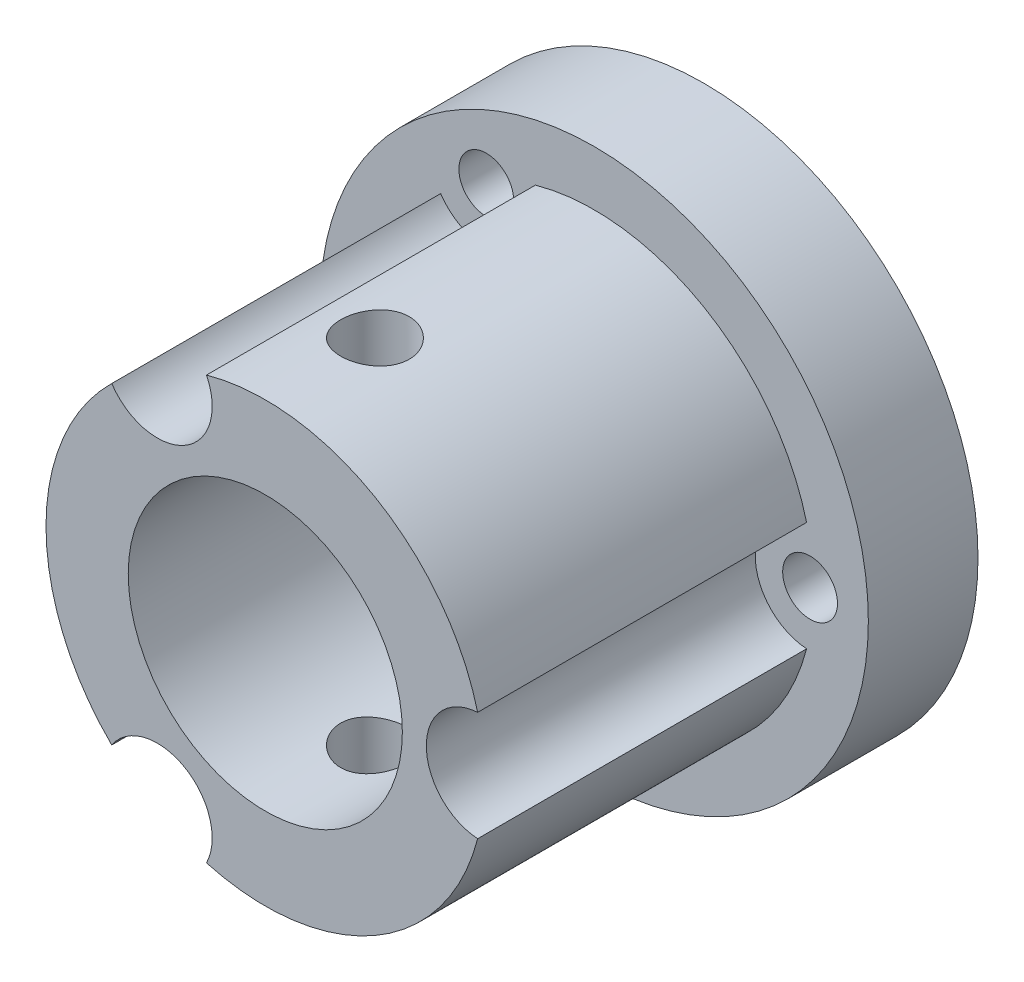
ISO-10303-21;
HEADER;
FILE_DESCRIPTION(('STEP AP214'),'2;1');
FILE_NAME('part.step','',(''),(''),'','','');
FILE_SCHEMA(('AUTOMOTIVE_DESIGN { 1 0 10303 214 1 1 1 1 }'));
ENDSEC;
DATA;
#1=APPLICATION_CONTEXT('core data for automotive mechanical design processes');
#2=APPLICATION_PROTOCOL_DEFINITION('international standard','automotive_design',2000,#1);
#3=PRODUCT_CONTEXT('',#1,'mechanical');
#4=PRODUCT('Part','Part','',(#3));
#5=PRODUCT_RELATED_PRODUCT_CATEGORY('part','',(#4));
#6=PRODUCT_DEFINITION_FORMATION('','',#4);
#7=PRODUCT_DEFINITION_CONTEXT('part definition',#1,'design');
#8=PRODUCT_DEFINITION('design','',#6,#7);
#9=PRODUCT_DEFINITION_SHAPE('','',#8);
#10=(LENGTH_UNIT() NAMED_UNIT(*) SI_UNIT(.MILLI.,.METRE.));
#11=(NAMED_UNIT(*) PLANE_ANGLE_UNIT() SI_UNIT($,.RADIAN.));
#12=(NAMED_UNIT(*) SI_UNIT($,.STERADIAN.) SOLID_ANGLE_UNIT());
#13=UNCERTAINTY_MEASURE_WITH_UNIT(LENGTH_MEASURE(1.E-05),#10,'distance_accuracy_value','');
#14=(GEOMETRIC_REPRESENTATION_CONTEXT(3) GLOBAL_UNCERTAINTY_ASSIGNED_CONTEXT((#13)) GLOBAL_UNIT_ASSIGNED_CONTEXT((#10,
#11,#12)) REPRESENTATION_CONTEXT('',''));
#15=CARTESIAN_POINT('',(0.,0.,0.));
#16=DIRECTION('',(0.,0.,1.));
#17=DIRECTION('',(1.,0.,0.));
#18=AXIS2_PLACEMENT_3D('',#15,#16,#17);
#19=CARTESIAN_POINT('',(0.,0.,25.4));
#20=DIRECTION('',(0.,0.,1.));
#21=DIRECTION('',(1.,0.,0.));
#22=AXIS2_PLACEMENT_3D('',#19,#20,#21);
#23=PLANE('',#22);
#24=CARTESIAN_POINT('',(0.,0.,25.4));
#25=DIRECTION('',(0.,0.,1.));
#26=DIRECTION('',(1.,0.,0.));
#27=AXIS2_PLACEMENT_3D('',#24,#25,#26);
#28=CIRCLE('',#27,7.9375);
#29=CARTESIAN_POINT('',(7.9375,0.,25.4));
#30=VERTEX_POINT('',#29);
#31=EDGE_CURVE('E226',#30,#30,#28,.F.);
#32=ORIENTED_EDGE('',*,*,#31,.T.);
#33=EDGE_LOOP('',(#32));
#34=FACE_BOUND('',#33,.T.);
#35=CARTESIAN_POINT('',(12.5,0.,25.4));
#36=DIRECTION('',(0.,0.,1.));
#37=DIRECTION('',(1.,0.,0.));
#38=AXIS2_PLACEMENT_3D('',#35,#36,#37);
#39=CIRCLE('',#38,3.175);
#40=CARTESIAN_POINT('',(12.298375,3.16859154189602,25.4));
#41=VERTEX_POINT('',#40);
#42=CARTESIAN_POINT('',(12.298375,-3.16859154189602,25.4));
#43=VERTEX_POINT('',#42);
#44=EDGE_CURVE('E102',#41,#43,#39,.T.);
#45=ORIENTED_EDGE('',*,*,#44,.F.);
#46=CARTESIAN_POINT('',(0.,0.,25.4));
#47=DIRECTION('',(0.,0.,1.));
#48=DIRECTION('',(1.,0.,0.));
#49=AXIS2_PLACEMENT_3D('',#46,#47,#48);
#50=CIRCLE('',#49,12.7);
#51=CARTESIAN_POINT('',(-3.40510673050151,12.2350009462155,25.4));
#52=VERTEX_POINT('',#51);
#53=EDGE_CURVE('E372',#41,#52,#50,.T.);
#54=ORIENTED_EDGE('',*,*,#53,.T.);
#55=CARTESIAN_POINT('',(-6.24999999999997,10.8253175473055,25.4));
#56=DIRECTION('',(0.,0.,1.));
#57=DIRECTION('',(1.,0.,0.));
#58=AXIS2_PLACEMENT_3D('',#55,#56,#57);
#59=CIRCLE('',#58,3.175);
#60=CARTESIAN_POINT('',(-8.89326826949843,9.06640940431946,25.4));
#61=VERTEX_POINT('',#60);
#62=EDGE_CURVE('E207',#61,#52,#59,.T.);
#63=ORIENTED_EDGE('',*,*,#62,.F.);
#64=CARTESIAN_POINT('',(-8.8932682694985,-9.06640940431939,25.4));
#65=VERTEX_POINT('',#64);
#66=EDGE_CURVE('E369',#61,#65,#50,.T.);
#67=ORIENTED_EDGE('',*,*,#66,.T.);
#68=CARTESIAN_POINT('',(-6.25000000000005,-10.8253175473055,25.4));
#69=DIRECTION('',(0.,0.,1.));
#70=DIRECTION('',(1.,0.,0.));
#71=AXIS2_PLACEMENT_3D('',#68,#69,#70);
#72=CIRCLE('',#71,3.175);
#73=CARTESIAN_POINT('',(-3.4051067305016,-12.2350009462154,25.4));
#74=VERTEX_POINT('',#73);
#75=EDGE_CURVE('E205',#74,#65,#72,.T.);
#76=ORIENTED_EDGE('',*,*,#75,.F.);
#77=EDGE_CURVE('E92',#74,#43,#50,.T.);
#78=ORIENTED_EDGE('',*,*,#77,.T.);
#79=EDGE_LOOP('',(#45,#54,#63,#67,#76,#78));
#80=FACE_BOUND('',#79,.T.);
#81=ADVANCED_FACE('F35',(#34,#80),#23,.T.);
#82=CARTESIAN_POINT('',(0.,-15.875,19.05));
#83=DIRECTION('',(0.,1.,0.));
#84=DIRECTION('',(0.,0.,1.));
#85=AXIS2_PLACEMENT_3D('',#82,#83,#84);
#86=CYLINDRICAL_SURFACE('',#85,1.9844);
#87=CARTESIAN_POINT('',(0.,7.9375,21.0344));
#88=CARTESIAN_POINT('',(-0.109639495300131,7.93749814617787,21.0343969232858));
#89=CARTESIAN_POINT('',(-0.219313359865419,7.93520571732519,21.0252829452529));
#90=CARTESIAN_POINT('',(-0.435517834281674,7.92628289923159,20.9891224451867));
#91=CARTESIAN_POINT('',(-0.542046626898072,7.91965005143554,20.9620657597011));
#92=CARTESIAN_POINT('',(-0.748807550974291,7.90278087720989,20.890942227106));
#93=CARTESIAN_POINT('',(-0.849047076454651,7.89254887937063,20.8468958069255));
#94=CARTESIAN_POINT('',(-1.04071432289624,7.86957111937874,20.7431149801415));
#95=CARTESIAN_POINT('',(-1.13214174643089,7.85682527242272,20.6833800442716));
#96=CARTESIAN_POINT('',(-1.30547263455752,7.82991001792708,20.5486182940193));
#97=CARTESIAN_POINT('',(-1.38716875416161,7.81571864705851,20.4733291653599));
#98=CARTESIAN_POINT('',(-1.53691588894592,7.78765771852449,20.3101578274106));
#99=CARTESIAN_POINT('',(-1.60496536335356,7.77378819735357,20.222274198059));
#100=CARTESIAN_POINT('',(-1.72646272123663,7.74771988482129,20.0347985799758));
#101=CARTESIAN_POINT('',(-1.77967865772164,7.73554897573591,19.9350520439062));
#102=CARTESIAN_POINT('',(-1.86850671130856,7.71457621887333,19.7276753651048));
#103=CARTESIAN_POINT('',(-1.90412164288412,7.7057738325062,19.6200464859547));
#104=CARTESIAN_POINT('',(-1.95602936354866,7.69276048780295,19.4022402365392));
#105=CARTESIAN_POINT('',(-1.9726949602536,7.68846107719747,19.2921571216639));
#106=CARTESIAN_POINT('',(-1.98739216996071,7.68467571786105,19.0706800188642));
#107=CARTESIAN_POINT('',(-1.98542681460433,7.68518898600753,18.9592862471569));
#108=CARTESIAN_POINT('',(-1.96321535658933,7.69089147981376,18.7412072199152));
#109=CARTESIAN_POINT('',(-1.94341350610029,7.69596706582694,18.634473281382));
#110=CARTESIAN_POINT('',(-1.88679984070614,7.71004120176449,18.4258925722408));
#111=CARTESIAN_POINT('',(-1.8499868139754,7.71904003116647,18.3240461503757));
#112=CARTESIAN_POINT('',(-1.76001718772595,7.74005101888939,18.1269402748486));
#113=CARTESIAN_POINT('',(-1.70669935717745,7.75209267865873,18.0317576925102));
#114=CARTESIAN_POINT('',(-1.58534638430888,7.77781587987156,17.8515311676544));
#115=CARTESIAN_POINT('',(-1.51730866658781,7.79149770809297,17.766489003355));
#116=CARTESIAN_POINT('',(-1.36614610036042,7.81943812321844,17.6064115310996));
#117=CARTESIAN_POINT('',(-1.2826463631045,7.83370203161144,17.5317307182577));
#118=CARTESIAN_POINT('',(-1.10413734292041,7.86084761283816,17.3973645243173));
#119=CARTESIAN_POINT('',(-1.00912770853849,7.87372924344148,17.3376796012881));
#120=CARTESIAN_POINT('',(-0.809790044637993,7.89672297694348,17.2348692264335));
#121=CARTESIAN_POINT('',(-0.705431128113981,7.90682541473291,17.1918013593707));
#122=CARTESIAN_POINT('',(-0.49064577602287,7.92305219211687,17.1239188568949));
#123=CARTESIAN_POINT('',(-0.380220505466809,7.92917729266133,17.0991007297947));
#124=CARTESIAN_POINT('',(-0.159467894484081,7.93664665589791,17.0689635978608));
#125=CARTESIAN_POINT('',(-0.049210366576516,7.9381092546679,17.0631618403625));
#126=CARTESIAN_POINT('',(0.170700248198422,7.93642586322305,17.0698980732427));
#127=CARTESIAN_POINT('',(0.280353388585359,7.93328028787152,17.0824344126844));
#128=CARTESIAN_POINT('',(0.494265031330528,7.92280982087153,17.1250930717754));
#129=CARTESIAN_POINT('',(0.598579397144594,7.91554755417933,17.1549520280242));
#130=CARTESIAN_POINT('',(0.800713171879479,7.89766228158763,17.2311075110972));
#131=CARTESIAN_POINT('',(0.898531923676685,7.88703893629206,17.2774056979851));
#132=CARTESIAN_POINT('',(1.0868184244775,7.86332652330072,17.3860610028415));
#133=CARTESIAN_POINT('',(1.17712492975584,7.85019704677882,17.4486885059657));
#134=CARTESIAN_POINT('',(1.34611805759531,7.82299247651863,17.5878790615911));
#135=CARTESIAN_POINT('',(1.42480267047705,7.80891721984507,17.6644445191712));
#136=CARTESIAN_POINT('',(1.57030780350973,7.78098149779881,17.8315789501613));
#137=CARTESIAN_POINT('',(1.63678969157185,7.7671347855886,17.9224455279963));
#138=CARTESIAN_POINT('',(1.75356116347712,7.74160939586383,18.1143301701208));
#139=CARTESIAN_POINT('',(1.80385146607038,7.72993062212348,18.2153477835411));
#140=CARTESIAN_POINT('',(1.88643787729623,7.71019209376046,18.424125429863));
#141=CARTESIAN_POINT('',(1.91884059406098,7.7021109547571,18.5318411641322));
#142=CARTESIAN_POINT('',(1.9650129209302,7.69046215449254,18.7514242910163));
#143=CARTESIAN_POINT('',(1.97878660614956,7.68689350613167,18.8632907701497));
#144=CARTESIAN_POINT('',(1.98709695836272,7.68474898062991,19.0845539473272));
#145=CARTESIAN_POINT('',(1.98217486750309,7.68603262453657,19.1939292808248));
#146=CARTESIAN_POINT('',(1.95447211327851,7.69312325577015,19.4102373471241));
#147=CARTESIAN_POINT('',(1.93169180882575,7.69893015218928,19.5171701289715));
#148=CARTESIAN_POINT('',(1.86921488341256,7.7143347026777,19.7249691508837));
#149=CARTESIAN_POINT('',(1.82961977996717,7.72390958292117,19.8258677176264));
#150=CARTESIAN_POINT('',(1.73471756159539,7.74577445793793,20.019661645251));
#151=CARTESIAN_POINT('',(1.67940826740484,7.75806482924642,20.1125558937535));
#152=CARTESIAN_POINT('',(1.55295084787638,7.78437647556316,20.2903196698549));
#153=CARTESIAN_POINT('',(1.48142717557716,7.79843454059434,20.3749166399913));
#154=CARTESIAN_POINT('',(1.32530312674108,7.8264779393033,20.5310837967562));
#155=CARTESIAN_POINT('',(1.24069964932539,7.84046325491932,20.6026508855573));
#156=CARTESIAN_POINT('',(1.05896823527396,7.8670876351296,20.731990524034));
#157=CARTESIAN_POINT('',(0.961641217099816,7.87969773013835,20.7894897632627));
#158=CARTESIAN_POINT('',(0.758395964671996,7.90184519666337,20.8872189970341));
#159=CARTESIAN_POINT('',(0.652483951220501,7.9113847686411,20.9274613654542));
#160=CARTESIAN_POINT('',(0.455634554393617,7.92490615121753,20.9835614717049));
#161=CARTESIAN_POINT('',(0.365634762849764,7.9295964027036,21.0025847081983));
#162=CARTESIAN_POINT('',(0.183764601477219,7.93589398804253,21.0280047868634));
#163=CARTESIAN_POINT('',(0.0918943728721858,7.93750155378152,21.0344025787489));
#164=CARTESIAN_POINT('',(0.,7.9375,21.0344));
#165=B_SPLINE_CURVE_WITH_KNOTS('',3,(#87,#88,#89,#90,#91,#92,#93,#94,#95,#96,#97,#98,#99,#100,
#101,#102,#103,#104,#105,#106,#107,#108,#109,#110,#111,#112,#113,#114,#115,#116,#117,#118,#119,
#120,#121,#122,#123,#124,#125,#126,#127,#128,#129,#130,#131,#132,#133,#134,#135,#136,#137,#138,
#139,#140,#141,#142,#143,#144,#145,#146,#147,#148,#149,#150,#151,#152,#153,#154,#155,#156,#157,
#158,#159,#160,#161,#162,#163,#164),.UNSPECIFIED.,.T.,.F.,(4,2,2,2,2,2,2,2,2,2,2,2,2,2,2,2,2,2,
2,2,2,2,2,2,2,2,2,2,2,2,2,2,2,2,2,2,2,2,4),(0.,0.328581726429248,0.657349733578717,
0.985723685587273,1.31410871701386,1.6485653273611,1.98305967825167,2.32252342182313,
2.66193286615726,2.9945425387529,3.32709808980081,3.65159299999745,3.97611102981145,
4.30390494936176,4.63175626639546,4.96895629413084,5.30616662083766,5.64453524004173,
5.98283910298179,6.31248535752751,6.64210193660417,6.9668338588559,7.29159858246334,
7.6221262116968,7.95271092963985,8.29141035050504,8.63009473431125,8.96673818080006,
9.3033079743605,9.630209365993,9.95710418776963,10.282052864126,10.6070466267974,
10.9405184790222,11.2740695102545,11.6136615442262,11.9530096680912,12.2284312502708,
12.5038321138448),.UNSPECIFIED.);
#166=CARTESIAN_POINT('',(0.,7.9375,21.0344));
#167=VERTEX_POINT('',#166);
#168=EDGE_CURVE('E120',#167,#167,#165,.T.);
#169=ORIENTED_EDGE('',*,*,#168,.T.);
#170=EDGE_LOOP('',(#169));
#171=FACE_BOUND('',#170,.T.);
#172=CARTESIAN_POINT('',(0.,12.7,21.0344));
#173=CARTESIAN_POINT('',(-0.110741485558747,12.6999981758811,21.0343954769552));
#174=CARTESIAN_POINT('',(-0.221545844648834,12.6985363877157,21.025098633041));
#175=CARTESIAN_POINT('',(-0.44005357589214,12.6928457382515,20.9881685033219));
#176=CARTESIAN_POINT('',(-0.547753887190118,12.6886142371026,20.9605177237833));
#177=CARTESIAN_POINT('',(-0.756859980252466,12.6778593581476,20.8877293478182));
#178=CARTESIAN_POINT('',(-0.8582705911889,12.6713377649388,20.8426053649103));
#179=CARTESIAN_POINT('',(-1.05206618627136,12.6567220382418,20.7361856371634));
#180=CARTESIAN_POINT('',(-1.14445234103753,12.6486281091195,20.6748919936221));
#181=CARTESIAN_POINT('',(-1.31837157880454,12.6316903017685,20.5373214413546));
#182=CARTESIAN_POINT('',(-1.39981736639555,12.6228412182645,20.4609348013274));
#183=CARTESIAN_POINT('',(-1.54879042313713,12.6054308611888,20.2955827581125));
#184=CARTESIAN_POINT('',(-1.61631686416433,12.5968696047667,20.2066166070447));
#185=CARTESIAN_POINT('',(-1.73587791406675,12.580953780478,20.0180395888433));
#186=CARTESIAN_POINT('',(-1.78782737712619,12.5736059400034,19.9183741206569));
#187=CARTESIAN_POINT('',(-1.87421555590689,12.5610204063851,19.7115981002836));
#188=CARTESIAN_POINT('',(-1.90865530832943,12.5557825883166,19.6044879893001));
#189=CARTESIAN_POINT('',(-1.95877388560662,12.5480615668127,19.3867839665031));
#190=CARTESIAN_POINT('',(-1.97460263373942,12.5455563624797,19.2762253638796));
#191=CARTESIAN_POINT('',(-1.98751447327296,12.5435175156531,19.0539951184959));
#192=CARTESIAN_POINT('',(-1.98459873151439,12.5439836881918,18.94232354545));
#193=CARTESIAN_POINT('',(-1.96022673157593,12.5478148159945,18.7221004154954));
#194=CARTESIAN_POINT('',(-1.9389379714329,12.5511535823462,18.6135298001777));
#195=CARTESIAN_POINT('',(-1.878686685744,12.5603127626664,18.4015207000823));
#196=CARTESIAN_POINT('',(-1.83972362143832,12.566133252284,18.2980823718569));
#197=CARTESIAN_POINT('',(-1.74505713655031,12.5796287536561,18.098767434479));
#198=CARTESIAN_POINT('',(-1.68928327566635,12.5873115417285,18.0029248297312));
#199=CARTESIAN_POINT('',(-1.56262852184226,12.6036604456287,17.8218953748495));
#200=CARTESIAN_POINT('',(-1.49174655445398,12.6123266313727,17.7367092832625));
#201=CARTESIAN_POINT('',(-1.33597071620569,12.6297813519704,17.5784406499411));
#202=CARTESIAN_POINT('',(-1.25093294310635,12.6385701929585,17.5054997033569));
#203=CARTESIAN_POINT('',(-1.06974848630014,12.6551926292802,17.3749023181355));
#204=CARTESIAN_POINT('',(-0.973601746162281,12.663026219761,17.3172459571455));
#205=CARTESIAN_POINT('',(-0.772802099609145,12.6768647349272,17.2188450861696));
#206=CARTESIAN_POINT('',(-0.668143466855848,12.6828684154396,17.1781120757266));
#207=CARTESIAN_POINT('',(-0.453356256932798,12.6923604184641,17.1148402742096));
#208=CARTESIAN_POINT('',(-0.343228081986561,12.695848925647,17.0923001473498));
#209=CARTESIAN_POINT('',(-0.121849387558565,12.6998929281133,17.0662435583271));
#210=CARTESIAN_POINT('',(-0.0106222962847597,12.7004784187626,17.0625325354165));
#211=CARTESIAN_POINT('',(0.210865296696423,12.6987322528475,17.0737222430999));
#212=CARTESIAN_POINT('',(0.321125830828115,12.696400694519,17.0886223469367));
#213=CARTESIAN_POINT('',(0.536956862436916,12.689100961522,17.1364495432032));
#214=CARTESIAN_POINT('',(0.642549000716203,12.6841467364416,17.1692812888306));
#215=CARTESIAN_POINT('',(0.846730079757925,12.6721551986553,17.2519388508591));
#216=CARTESIAN_POINT('',(0.945318667426954,12.6651177810147,17.3017655233486));
#217=CARTESIAN_POINT('',(1.13354582980773,12.6496668937654,17.4174510482176));
#218=CARTESIAN_POINT('',(1.22310810463442,12.6412430597896,17.4834326348368));
#219=CARTESIAN_POINT('',(1.38995795886933,12.6239877080959,17.6293848819608));
#220=CARTESIAN_POINT('',(1.46724476007986,12.6151561645771,17.7093564286776));
#221=CARTESIAN_POINT('',(1.60806255020937,12.5979849646598,17.8818870328726));
#222=CARTESIAN_POINT('',(1.6714627353761,12.5896504824628,17.9745534454487));
#223=CARTESIAN_POINT('',(1.78179682439201,12.5745105094139,18.1693351433738));
#224=CARTESIAN_POINT('',(1.82873120225502,12.567704974549,18.2714501566117));
#225=CARTESIAN_POINT('',(1.90460121818399,12.5564314082557,18.4818491844906));
#226=CARTESIAN_POINT('',(1.93360433418857,12.5519546236222,18.5901083766622));
#227=CARTESIAN_POINT('',(1.97300245931644,12.5458226363328,18.8100367803512));
#228=CARTESIAN_POINT('',(1.98339887307441,12.5441672206901,18.9217057338157));
#229=CARTESIAN_POINT('',(1.98525296113623,12.5438738078723,19.1439791918534));
#230=CARTESIAN_POINT('',(1.97691637774366,12.5452030306445,19.2545819915178));
#231=CARTESIAN_POINT('',(1.94198345988495,12.5506576656248,19.4727915038092));
#232=CARTESIAN_POINT('',(1.91538716496141,12.5547830717777,19.5803982229238));
#233=CARTESIAN_POINT('',(1.84476478151805,12.5653534198561,19.7894957831955));
#234=CARTESIAN_POINT('',(1.80075429016437,12.5717962856618,19.8909920038003));
#235=CARTESIAN_POINT('',(1.69657349642307,12.5862779325442,20.0851934330077));
#236=CARTESIAN_POINT('',(1.63640255354766,12.5943167768711,20.1778982929849));
#237=CARTESIAN_POINT('',(1.50086615746827,12.6111894720918,20.3529286849404));
#238=CARTESIAN_POINT('',(1.42534867885279,12.6200307445553,20.4351357940484));
#239=CARTESIAN_POINT('',(1.26158410314089,12.6374511611803,20.5857828397311));
#240=CARTESIAN_POINT('',(1.17333406002489,12.646030244119,20.6542195813632));
#241=CARTESIAN_POINT('',(0.985983557637632,12.662018824335,20.7757535944596));
#242=CARTESIAN_POINT('',(0.886821143369611,12.669420991417,20.8287563166863));
#243=CARTESIAN_POINT('',(0.680929768018915,12.6821501072581,20.9172731071597));
#244=CARTESIAN_POINT('',(0.574208663003951,12.6874791743248,20.9528050370341));
#245=CARTESIAN_POINT('',(0.389192903708317,12.6942645503222,20.9974367891712));
#246=CARTESIAN_POINT('',(0.312032345831392,12.6964041354917,21.011276444353));
#247=CARTESIAN_POINT('',(0.156591661852891,12.6992724953764,21.0297595843364));
#248=CARTESIAN_POINT('',(0.0783115515158305,12.7000012899374,21.0344031985001));
#249=CARTESIAN_POINT('',(0.,12.7,21.0344));
#250=B_SPLINE_CURVE_WITH_KNOTS('',3,(#172,#173,#174,#175,#176,#177,#178,#179,#180,#181,#182,
#183,#184,#185,#186,#187,#188,#189,#190,#191,#192,#193,#194,#195,#196,#197,#198,#199,#200,#201,
#202,#203,#204,#205,#206,#207,#208,#209,#210,#211,#212,#213,#214,#215,#216,#217,#218,#219,#220,
#221,#222,#223,#224,#225,#226,#227,#228,#229,#230,#231,#232,#233,#234,#235,#236,#237,#238,#239,
#240,#241,#242,#243,#244,#245,#246,#247,#248,#249),.UNSPECIFIED.,.T.,.F.,(4,2,2,2,2,2,2,2,2,2,2,
2,2,2,2,2,2,2,2,2,2,2,2,2,2,2,2,2,2,2,2,2,2,2,2,2,2,2,4),(0.,0.331938264638891,
0.664193365619452,0.996190123028433,1.32814375765807,1.66260604002083,1.99708821528135,
2.33336671294276,2.66962529817025,3.00315613664923,3.3366662131021,3.66716757390438,
3.99767900994447,4.32959507039737,4.66153474371408,4.99708175066714,5.33263046219654,
5.6684068101362,6.00415850194633,6.336433709559,6.66869772761606,6.99921197959668,
7.32974288308828,7.66286741537283,7.99601305750369,8.33217330868488,8.66832388176884,
9.00320164669774,9.33805413037253,9.66924696473638,10.0004390818829,10.3313352331539,
10.6622445007803,10.9966073446568,11.3310476767637,11.6674956585537,12.0035989468054,
12.2383345209029,12.4730667929163),.UNSPECIFIED.);
#251=CARTESIAN_POINT('',(0.,12.7,21.0344));
#252=VERTEX_POINT('',#251);
#253=EDGE_CURVE('E149',#252,#252,#250,.T.);
#254=ORIENTED_EDGE('',*,*,#253,.F.);
#255=EDGE_LOOP('',(#254));
#256=FACE_BOUND('',#255,.T.);
#257=ADVANCED_FACE('F135',(#171,#256),#86,.F.);
#258=CARTESIAN_POINT('',(0.,-7.9375,21.0344));
#259=CARTESIAN_POINT('',(0.109639495300131,-7.93749814617787,21.0343969232858));
#260=CARTESIAN_POINT('',(0.219313359865419,-7.93520571732519,21.0252829452529));
#261=CARTESIAN_POINT('',(0.435517834281674,-7.92628289923159,20.9891224451867));
#262=CARTESIAN_POINT('',(0.542046626898072,-7.91965005143554,20.9620657597011));
#263=CARTESIAN_POINT('',(0.748807550974291,-7.90278087720989,20.890942227106));
#264=CARTESIAN_POINT('',(0.849047076454651,-7.89254887937063,20.8468958069255));
#265=CARTESIAN_POINT('',(1.04071432289624,-7.86957111937874,20.7431149801415));
#266=CARTESIAN_POINT('',(1.13214174643089,-7.85682527242272,20.6833800442716));
#267=CARTESIAN_POINT('',(1.30547263455752,-7.82991001792708,20.5486182940193));
#268=CARTESIAN_POINT('',(1.38716875416161,-7.81571864705851,20.4733291653599));
#269=CARTESIAN_POINT('',(1.53691588894592,-7.78765771852449,20.3101578274106));
#270=CARTESIAN_POINT('',(1.60496536335356,-7.77378819735357,20.222274198059));
#271=CARTESIAN_POINT('',(1.72646272123663,-7.74771988482129,20.0347985799758));
#272=CARTESIAN_POINT('',(1.77967865772164,-7.73554897573591,19.9350520439062));
#273=CARTESIAN_POINT('',(1.86850671130856,-7.71457621887333,19.7276753651048));
#274=CARTESIAN_POINT('',(1.90412164288412,-7.7057738325062,19.6200464859547));
#275=CARTESIAN_POINT('',(1.95602936354866,-7.69276048780295,19.4022402365392));
#276=CARTESIAN_POINT('',(1.9726949602536,-7.68846107719747,19.2921571216639));
#277=CARTESIAN_POINT('',(1.98739216996071,-7.68467571786105,19.0706800188642));
#278=CARTESIAN_POINT('',(1.98542681460433,-7.68518898600753,18.9592862471569));
#279=CARTESIAN_POINT('',(1.96321535658933,-7.69089147981376,18.7412072199152));
#280=CARTESIAN_POINT('',(1.94341350610029,-7.69596706582694,18.634473281382));
#281=CARTESIAN_POINT('',(1.88679984070614,-7.71004120176449,18.4258925722408));
#282=CARTESIAN_POINT('',(1.8499868139754,-7.71904003116647,18.3240461503757));
#283=CARTESIAN_POINT('',(1.76001718772595,-7.74005101888939,18.1269402748486));
#284=CARTESIAN_POINT('',(1.70669935717745,-7.75209267865873,18.0317576925102));
#285=CARTESIAN_POINT('',(1.58534638430888,-7.77781587987156,17.8515311676544));
#286=CARTESIAN_POINT('',(1.51730866658781,-7.79149770809297,17.766489003355));
#287=CARTESIAN_POINT('',(1.36614610036042,-7.81943812321844,17.6064115310996));
#288=CARTESIAN_POINT('',(1.2826463631045,-7.83370203161144,17.5317307182577));
#289=CARTESIAN_POINT('',(1.10413734292041,-7.86084761283816,17.3973645243173));
#290=CARTESIAN_POINT('',(1.00912770853849,-7.87372924344148,17.3376796012881));
#291=CARTESIAN_POINT('',(0.809790044637993,-7.89672297694348,17.2348692264335));
#292=CARTESIAN_POINT('',(0.705431128113981,-7.90682541473291,17.1918013593707));
#293=CARTESIAN_POINT('',(0.49064577602287,-7.92305219211687,17.1239188568949));
#294=CARTESIAN_POINT('',(0.380220505466809,-7.92917729266133,17.0991007297947));
#295=CARTESIAN_POINT('',(0.159467894484081,-7.93664665589791,17.0689635978608));
#296=CARTESIAN_POINT('',(0.049210366576516,-7.9381092546679,17.0631618403625));
#297=CARTESIAN_POINT('',(-0.170700248198422,-7.93642586322305,17.0698980732427));
#298=CARTESIAN_POINT('',(-0.280353388585359,-7.93328028787152,17.0824344126844));
#299=CARTESIAN_POINT('',(-0.494265031330528,-7.92280982087153,17.1250930717754));
#300=CARTESIAN_POINT('',(-0.598579397144594,-7.91554755417933,17.1549520280242));
#301=CARTESIAN_POINT('',(-0.800713171879479,-7.89766228158763,17.2311075110972));
#302=CARTESIAN_POINT('',(-0.898531923676685,-7.88703893629206,17.2774056979851));
#303=CARTESIAN_POINT('',(-1.0868184244775,-7.86332652330072,17.3860610028415));
#304=CARTESIAN_POINT('',(-1.17712492975584,-7.85019704677882,17.4486885059657));
#305=CARTESIAN_POINT('',(-1.34611805759531,-7.82299247651863,17.5878790615911));
#306=CARTESIAN_POINT('',(-1.42480267047705,-7.80891721984507,17.6644445191712));
#307=CARTESIAN_POINT('',(-1.57030780350973,-7.78098149779881,17.8315789501613));
#308=CARTESIAN_POINT('',(-1.63678969157185,-7.7671347855886,17.9224455279963));
#309=CARTESIAN_POINT('',(-1.75356116347712,-7.74160939586383,18.1143301701208));
#310=CARTESIAN_POINT('',(-1.80385146607038,-7.72993062212348,18.2153477835411));
#311=CARTESIAN_POINT('',(-1.88643787729623,-7.71019209376046,18.424125429863));
#312=CARTESIAN_POINT('',(-1.91884059406098,-7.7021109547571,18.5318411641322));
#313=CARTESIAN_POINT('',(-1.9650129209302,-7.69046215449254,18.7514242910163));
#314=CARTESIAN_POINT('',(-1.97878660614956,-7.68689350613167,18.8632907701497));
#315=CARTESIAN_POINT('',(-1.98709695836272,-7.68474898062991,19.0845539473272));
#316=CARTESIAN_POINT('',(-1.98217486750309,-7.68603262453657,19.1939292808248));
#317=CARTESIAN_POINT('',(-1.95447211327851,-7.69312325577015,19.4102373471241));
#318=CARTESIAN_POINT('',(-1.93169180882575,-7.69893015218928,19.5171701289715));
#319=CARTESIAN_POINT('',(-1.86921488341256,-7.7143347026777,19.7249691508837));
#320=CARTESIAN_POINT('',(-1.82961977996717,-7.72390958292117,19.8258677176264));
#321=CARTESIAN_POINT('',(-1.73471756159539,-7.74577445793793,20.019661645251));
#322=CARTESIAN_POINT('',(-1.67940826740484,-7.75806482924642,20.1125558937535));
#323=CARTESIAN_POINT('',(-1.55295084787638,-7.78437647556316,20.2903196698549));
#324=CARTESIAN_POINT('',(-1.48142717557716,-7.79843454059434,20.3749166399913));
#325=CARTESIAN_POINT('',(-1.32530312674108,-7.8264779393033,20.5310837967562));
#326=CARTESIAN_POINT('',(-1.24069964932539,-7.84046325491932,20.6026508855573));
#327=CARTESIAN_POINT('',(-1.05896823527396,-7.8670876351296,20.731990524034));
#328=CARTESIAN_POINT('',(-0.961641217099816,-7.87969773013835,20.7894897632627));
#329=CARTESIAN_POINT('',(-0.758395964671996,-7.90184519666337,20.8872189970341));
#330=CARTESIAN_POINT('',(-0.652483951220501,-7.9113847686411,20.9274613654542));
#331=CARTESIAN_POINT('',(-0.455634554393617,-7.92490615121753,20.9835614717049));
#332=CARTESIAN_POINT('',(-0.365634762849764,-7.9295964027036,21.0025847081983));
#333=CARTESIAN_POINT('',(-0.183764601477219,-7.93589398804253,21.0280047868634));
#334=CARTESIAN_POINT('',(-0.0918943728721858,-7.93750155378152,21.0344025787489));
#335=CARTESIAN_POINT('',(0.,-7.9375,21.0344));
#336=B_SPLINE_CURVE_WITH_KNOTS('',3,(#258,#259,#260,#261,#262,#263,#264,#265,#266,#267,#268,
#269,#270,#271,#272,#273,#274,#275,#276,#277,#278,#279,#280,#281,#282,#283,#284,#285,#286,#287,
#288,#289,#290,#291,#292,#293,#294,#295,#296,#297,#298,#299,#300,#301,#302,#303,#304,#305,#306,
#307,#308,#309,#310,#311,#312,#313,#314,#315,#316,#317,#318,#319,#320,#321,#322,#323,#324,#325,
#326,#327,#328,#329,#330,#331,#332,#333,#334,#335),.UNSPECIFIED.,.T.,.F.,(4,2,2,2,2,2,2,2,2,2,2,
2,2,2,2,2,2,2,2,2,2,2,2,2,2,2,2,2,2,2,2,2,2,2,2,2,2,2,4),(0.,0.328581726429248,
0.657349733578717,0.985723685587273,1.31410871701386,1.6485653273611,1.98305967825167,
2.32252342182313,2.66193286615726,2.9945425387529,3.32709808980081,3.65159299999745,
3.97611102981145,4.30390494936176,4.63175626639546,4.96895629413084,5.30616662083766,
5.64453524004173,5.98283910298179,6.31248535752751,6.64210193660417,6.9668338588559,
7.29159858246334,7.6221262116968,7.95271092963985,8.29141035050504,8.63009473431125,
8.96673818080006,9.3033079743605,9.630209365993,9.95710418776963,10.282052864126,
10.6070466267974,10.9405184790222,11.2740695102545,11.6136615442262,11.9530096680912,
12.2284312502708,12.5038321138448),.UNSPECIFIED.);
#337=CARTESIAN_POINT('',(0.,-7.9375,21.0344));
#338=VERTEX_POINT('',#337);
#339=EDGE_CURVE('E127',#338,#338,#336,.T.);
#340=ORIENTED_EDGE('',*,*,#339,.T.);
#341=EDGE_LOOP('',(#340));
#342=FACE_BOUND('',#341,.T.);
#343=CARTESIAN_POINT('',(0.,-12.7,21.0344));
#344=CARTESIAN_POINT('',(0.110741485558747,-12.6999981758811,21.0343954769552));
#345=CARTESIAN_POINT('',(0.221545844648834,-12.6985363877157,21.025098633041));
#346=CARTESIAN_POINT('',(0.44005357589214,-12.6928457382515,20.9881685033219));
#347=CARTESIAN_POINT('',(0.547753887190118,-12.6886142371026,20.9605177237833));
#348=CARTESIAN_POINT('',(0.756859980252466,-12.6778593581476,20.8877293478182));
#349=CARTESIAN_POINT('',(0.8582705911889,-12.6713377649388,20.8426053649103));
#350=CARTESIAN_POINT('',(1.05206618627136,-12.6567220382418,20.7361856371634));
#351=CARTESIAN_POINT('',(1.14445234103753,-12.6486281091195,20.6748919936221));
#352=CARTESIAN_POINT('',(1.31837157880454,-12.6316903017685,20.5373214413546));
#353=CARTESIAN_POINT('',(1.39981736639555,-12.6228412182645,20.4609348013274));
#354=CARTESIAN_POINT('',(1.54879042313713,-12.6054308611888,20.2955827581125));
#355=CARTESIAN_POINT('',(1.61631686416433,-12.5968696047667,20.2066166070447));
#356=CARTESIAN_POINT('',(1.73587791406675,-12.580953780478,20.0180395888433));
#357=CARTESIAN_POINT('',(1.78782737712619,-12.5736059400034,19.9183741206569));
#358=CARTESIAN_POINT('',(1.87421555590689,-12.5610204063851,19.7115981002836));
#359=CARTESIAN_POINT('',(1.90865530832943,-12.5557825883166,19.6044879893001));
#360=CARTESIAN_POINT('',(1.95877388560662,-12.5480615668127,19.3867839665031));
#361=CARTESIAN_POINT('',(1.97460263373942,-12.5455563624797,19.2762253638796));
#362=CARTESIAN_POINT('',(1.98751447327296,-12.5435175156531,19.0539951184959));
#363=CARTESIAN_POINT('',(1.98459873151439,-12.5439836881918,18.94232354545));
#364=CARTESIAN_POINT('',(1.96022673157593,-12.5478148159945,18.7221004154954));
#365=CARTESIAN_POINT('',(1.9389379714329,-12.5511535823462,18.6135298001777));
#366=CARTESIAN_POINT('',(1.878686685744,-12.5603127626664,18.4015207000823));
#367=CARTESIAN_POINT('',(1.83972362143832,-12.566133252284,18.2980823718569));
#368=CARTESIAN_POINT('',(1.74505713655031,-12.5796287536561,18.098767434479));
#369=CARTESIAN_POINT('',(1.68928327566635,-12.5873115417285,18.0029248297312));
#370=CARTESIAN_POINT('',(1.56262852184226,-12.6036604456287,17.8218953748495));
#371=CARTESIAN_POINT('',(1.49174655445398,-12.6123266313727,17.7367092832625));
#372=CARTESIAN_POINT('',(1.33597071620569,-12.6297813519704,17.5784406499411));
#373=CARTESIAN_POINT('',(1.25093294310635,-12.6385701929585,17.5054997033569));
#374=CARTESIAN_POINT('',(1.06974848630014,-12.6551926292802,17.3749023181355));
#375=CARTESIAN_POINT('',(0.973601746162281,-12.663026219761,17.3172459571455));
#376=CARTESIAN_POINT('',(0.772802099609145,-12.6768647349272,17.2188450861696));
#377=CARTESIAN_POINT('',(0.668143466855848,-12.6828684154396,17.1781120757266));
#378=CARTESIAN_POINT('',(0.453356256932798,-12.6923604184641,17.1148402742096));
#379=CARTESIAN_POINT('',(0.343228081986561,-12.695848925647,17.0923001473498));
#380=CARTESIAN_POINT('',(0.121849387558565,-12.6998929281133,17.0662435583271));
#381=CARTESIAN_POINT('',(0.0106222962847597,-12.7004784187626,17.0625325354165));
#382=CARTESIAN_POINT('',(-0.210865296696423,-12.6987322528475,17.0737222430999));
#383=CARTESIAN_POINT('',(-0.321125830828115,-12.696400694519,17.0886223469367));
#384=CARTESIAN_POINT('',(-0.536956862436916,-12.689100961522,17.1364495432032));
#385=CARTESIAN_POINT('',(-0.642549000716203,-12.6841467364416,17.1692812888306));
#386=CARTESIAN_POINT('',(-0.846730079757925,-12.6721551986553,17.2519388508591));
#387=CARTESIAN_POINT('',(-0.945318667426954,-12.6651177810147,17.3017655233486));
#388=CARTESIAN_POINT('',(-1.13354582980773,-12.6496668937654,17.4174510482176));
#389=CARTESIAN_POINT('',(-1.22310810463442,-12.6412430597896,17.4834326348368));
#390=CARTESIAN_POINT('',(-1.38995795886933,-12.6239877080959,17.6293848819608));
#391=CARTESIAN_POINT('',(-1.46724476007986,-12.6151561645771,17.7093564286776));
#392=CARTESIAN_POINT('',(-1.60806255020937,-12.5979849646598,17.8818870328726));
#393=CARTESIAN_POINT('',(-1.6714627353761,-12.5896504824628,17.9745534454487));
#394=CARTESIAN_POINT('',(-1.78179682439201,-12.5745105094139,18.1693351433738));
#395=CARTESIAN_POINT('',(-1.82873120225502,-12.567704974549,18.2714501566117));
#396=CARTESIAN_POINT('',(-1.90460121818399,-12.5564314082557,18.4818491844906));
#397=CARTESIAN_POINT('',(-1.93360433418857,-12.5519546236222,18.5901083766622));
#398=CARTESIAN_POINT('',(-1.97300245931644,-12.5458226363328,18.8100367803512));
#399=CARTESIAN_POINT('',(-1.98339887307441,-12.5441672206901,18.9217057338157));
#400=CARTESIAN_POINT('',(-1.98525296113623,-12.5438738078723,19.1439791918534));
#401=CARTESIAN_POINT('',(-1.97691637774366,-12.5452030306445,19.2545819915178));
#402=CARTESIAN_POINT('',(-1.94198345988495,-12.5506576656248,19.4727915038092));
#403=CARTESIAN_POINT('',(-1.91538716496141,-12.5547830717777,19.5803982229238));
#404=CARTESIAN_POINT('',(-1.84476478151805,-12.5653534198561,19.7894957831955));
#405=CARTESIAN_POINT('',(-1.80075429016437,-12.5717962856618,19.8909920038003));
#406=CARTESIAN_POINT('',(-1.69657349642307,-12.5862779325442,20.0851934330077));
#407=CARTESIAN_POINT('',(-1.63640255354766,-12.5943167768711,20.1778982929849));
#408=CARTESIAN_POINT('',(-1.50086615746827,-12.6111894720918,20.3529286849404));
#409=CARTESIAN_POINT('',(-1.42534867885279,-12.6200307445553,20.4351357940484));
#410=CARTESIAN_POINT('',(-1.26158410314089,-12.6374511611803,20.5857828397311));
#411=CARTESIAN_POINT('',(-1.17333406002489,-12.646030244119,20.6542195813632));
#412=CARTESIAN_POINT('',(-0.985983557637632,-12.662018824335,20.7757535944596));
#413=CARTESIAN_POINT('',(-0.886821143369611,-12.669420991417,20.8287563166863));
#414=CARTESIAN_POINT('',(-0.680929768018915,-12.6821501072581,20.9172731071597));
#415=CARTESIAN_POINT('',(-0.574208663003951,-12.6874791743248,20.9528050370341));
#416=CARTESIAN_POINT('',(-0.389192903708317,-12.6942645503222,20.9974367891712));
#417=CARTESIAN_POINT('',(-0.312032345831392,-12.6964041354917,21.011276444353));
#418=CARTESIAN_POINT('',(-0.156591661852891,-12.6992724953764,21.0297595843364));
#419=CARTESIAN_POINT('',(-0.0783115515158305,-12.7000012899374,21.0344031985001));
#420=CARTESIAN_POINT('',(0.,-12.7,21.0344));
#421=B_SPLINE_CURVE_WITH_KNOTS('',3,(#343,#344,#345,#346,#347,#348,#349,#350,#351,#352,#353,
#354,#355,#356,#357,#358,#359,#360,#361,#362,#363,#364,#365,#366,#367,#368,#369,#370,#371,#372,
#373,#374,#375,#376,#377,#378,#379,#380,#381,#382,#383,#384,#385,#386,#387,#388,#389,#390,#391,
#392,#393,#394,#395,#396,#397,#398,#399,#400,#401,#402,#403,#404,#405,#406,#407,#408,#409,#410,
#411,#412,#413,#414,#415,#416,#417,#418,#419,#420),.UNSPECIFIED.,.T.,.F.,(4,2,2,2,2,2,2,2,2,2,2,
2,2,2,2,2,2,2,2,2,2,2,2,2,2,2,2,2,2,2,2,2,2,2,2,2,2,2,4),(0.,0.331938264638891,
0.664193365619452,0.996190123028433,1.32814375765807,1.66260604002083,1.99708821528135,
2.33336671294276,2.66962529817025,3.00315613664923,3.3366662131021,3.66716757390438,
3.99767900994447,4.32959507039737,4.66153474371408,4.99708175066714,5.33263046219654,
5.6684068101362,6.00415850194633,6.336433709559,6.66869772761606,6.99921197959668,
7.32974288308828,7.66286741537283,7.99601305750369,8.33217330868488,8.66832388176884,
9.00320164669774,9.33805413037253,9.66924696473638,10.0004390818829,10.3313352331539,
10.6622445007803,10.9966073446568,11.3310476767637,11.6674956585537,12.0035989468054,
12.2383345209029,12.4730667929163),.UNSPECIFIED.);
#422=CARTESIAN_POINT('',(0.,-12.7,21.0344));
#423=VERTEX_POINT('',#422);
#424=EDGE_CURVE('E155',#423,#423,#421,.T.);
#425=ORIENTED_EDGE('',*,*,#424,.F.);
#426=EDGE_LOOP('',(#425));
#427=FACE_BOUND('',#426,.T.);
#428=ADVANCED_FACE('F140',(#342,#427),#86,.F.);
#429=CARTESIAN_POINT('',(-6.24999999999997,10.8253175473055,-2.63025612106915));
#430=DIRECTION('',(0.,0.,1.));
#431=DIRECTION('',(1.,0.,0.));
#432=AXIS2_PLACEMENT_3D('',#429,#430,#431);
#433=CYLINDRICAL_SURFACE('',#432,3.175);
#434=DIRECTION('',(0.,0.,1.));
#435=VECTOR('',#434,1.);
#436=CARTESIAN_POINT('',(-3.40510673050151,12.2350009462155,15.875));
#437=LINE('',#436,#435);
#438=CARTESIAN_POINT('',(-3.40510673050151,12.2350009462155,6.35));
#439=VERTEX_POINT('',#438);
#440=EDGE_CURVE('E160',#439,#52,#437,.T.);
#441=ORIENTED_EDGE('',*,*,#440,.F.);
#442=CARTESIAN_POINT('',(-6.24999999999997,10.8253175473055,6.35));
#443=DIRECTION('',(0.,0.,1.));
#444=DIRECTION('',(1.,0.,0.));
#445=AXIS2_PLACEMENT_3D('',#442,#443,#444);
#446=CIRCLE('',#445,3.175);
#447=CARTESIAN_POINT('',(-8.89326826949843,9.06640940431946,6.35));
#448=VERTEX_POINT('',#447);
#449=EDGE_CURVE('E111',#439,#448,#446,.F.);
#450=ORIENTED_EDGE('',*,*,#449,.T.);
#451=DIRECTION('',(0.,0.,1.));
#452=VECTOR('',#451,1.);
#453=CARTESIAN_POINT('',(-8.89326826949844,9.06640940431946,15.875));
#454=LINE('',#453,#452);
#455=EDGE_CURVE('E103',#61,#448,#454,.F.);
#456=ORIENTED_EDGE('',*,*,#455,.F.);
#457=ORIENTED_EDGE('',*,*,#62,.T.);
#458=EDGE_LOOP('',(#441,#450,#456,#457));
#459=FACE_BOUND('',#458,.T.);
#460=ADVANCED_FACE('F142',(#459),#433,.F.);
#461=CARTESIAN_POINT('',(12.5,0.,-2.63025612106915));
#462=DIRECTION('',(0.,0.,1.));
#463=DIRECTION('',(1.,0.,0.));
#464=AXIS2_PLACEMENT_3D('',#461,#462,#463);
#465=CYLINDRICAL_SURFACE('',#464,3.175);
#466=DIRECTION('',(0.,0.,1.));
#467=VECTOR('',#466,1.);
#468=CARTESIAN_POINT('',(12.298375,-3.16859154189602,15.875));
#469=LINE('',#468,#467);
#470=CARTESIAN_POINT('',(12.298375,-3.16859154189602,6.35));
#471=VERTEX_POINT('',#470);
#472=EDGE_CURVE('E88',#471,#43,#469,.T.);
#473=ORIENTED_EDGE('',*,*,#472,.F.);
#474=CARTESIAN_POINT('',(12.5,0.,6.35));
#475=DIRECTION('',(0.,0.,1.));
#476=DIRECTION('',(1.,0.,0.));
#477=AXIS2_PLACEMENT_3D('',#474,#475,#476);
#478=CIRCLE('',#477,3.175);
#479=CARTESIAN_POINT('',(12.298375,3.16859154189602,6.35));
#480=VERTEX_POINT('',#479);
#481=EDGE_CURVE('E100',#471,#480,#478,.F.);
#482=ORIENTED_EDGE('',*,*,#481,.T.);
#483=DIRECTION('',(0.,0.,1.));
#484=VECTOR('',#483,1.);
#485=CARTESIAN_POINT('',(12.298375,3.16859154189602,15.875));
#486=LINE('',#485,#484);
#487=EDGE_CURVE('E104',#41,#480,#486,.F.);
#488=ORIENTED_EDGE('',*,*,#487,.F.);
#489=ORIENTED_EDGE('',*,*,#44,.T.);
#490=EDGE_LOOP('',(#473,#482,#488,#489));
#491=FACE_BOUND('',#490,.T.);
#492=ADVANCED_FACE('F98',(#491),#465,.F.);
#493=CARTESIAN_POINT('',(-6.25000000000005,-10.8253175473055,-2.63025612106915));
#494=DIRECTION('',(0.,0.,1.));
#495=DIRECTION('',(1.,0.,0.));
#496=AXIS2_PLACEMENT_3D('',#493,#494,#495);
#497=CYLINDRICAL_SURFACE('',#496,3.175);
#498=DIRECTION('',(0.,0.,1.));
#499=VECTOR('',#498,1.);
#500=CARTESIAN_POINT('',(-8.8932682694985,-9.06640940431939,15.875));
#501=LINE('',#500,#499);
#502=CARTESIAN_POINT('',(-8.8932682694985,-9.06640940431939,6.35));
#503=VERTEX_POINT('',#502);
#504=EDGE_CURVE('E11',#503,#65,#501,.T.);
#505=ORIENTED_EDGE('',*,*,#504,.F.);
#506=CARTESIAN_POINT('',(-6.25000000000005,-10.8253175473055,6.35));
#507=DIRECTION('',(0.,0.,1.));
#508=DIRECTION('',(1.,0.,0.));
#509=AXIS2_PLACEMENT_3D('',#506,#507,#508);
#510=CIRCLE('',#509,3.175);
#511=CARTESIAN_POINT('',(-3.4051067305016,-12.2350009462154,6.35));
#512=VERTEX_POINT('',#511);
#513=EDGE_CURVE('E201',#503,#512,#510,.F.);
#514=ORIENTED_EDGE('',*,*,#513,.T.);
#515=DIRECTION('',(0.,0.,1.));
#516=VECTOR('',#515,1.);
#517=CARTESIAN_POINT('',(-3.4051067305016,-12.2350009462154,15.875));
#518=LINE('',#517,#516);
#519=EDGE_CURVE('E43',#74,#512,#518,.F.);
#520=ORIENTED_EDGE('',*,*,#519,.F.);
#521=ORIENTED_EDGE('',*,*,#75,.T.);
#522=EDGE_LOOP('',(#505,#514,#520,#521));
#523=FACE_BOUND('',#522,.T.);
#524=ADVANCED_FACE('F168',(#523),#497,.F.);
#525=CARTESIAN_POINT('',(-6.25000000000005,-10.8253175473055,14.8));
#526=DIRECTION('',(0.,0.,-1.));
#527=DIRECTION('',(-1.,0.,0.));
#528=AXIS2_PLACEMENT_3D('',#525,#526,#527);
#529=CYLINDRICAL_SURFACE('',#528,1.5875);
#530=CARTESIAN_POINT('',(-6.25000000000005,-10.8253175473055,0.));
#531=DIRECTION('',(0.,0.,-1.));
#532=DIRECTION('',(-1.,0.,0.));
#533=AXIS2_PLACEMENT_3D('',#530,#531,#532);
#534=CIRCLE('',#533,1.5875);
#535=CARTESIAN_POINT('',(-7.83750000000005,-10.8253175473055,0.));
#536=VERTEX_POINT('',#535);
#537=EDGE_CURVE('E197',#536,#536,#534,.T.);
#538=ORIENTED_EDGE('',*,*,#537,.T.);
#539=EDGE_LOOP('',(#538));
#540=FACE_BOUND('',#539,.T.);
#541=CARTESIAN_POINT('',(-6.25000000000005,-10.8253175473055,6.35));
#542=DIRECTION('',(0.,0.,1.));
#543=DIRECTION('',(1.,0.,0.));
#544=AXIS2_PLACEMENT_3D('',#541,#542,#543);
#545=CIRCLE('',#544,1.5875);
#546=CARTESIAN_POINT('',(-4.66250000000005,-10.8253175473055,6.35));
#547=VERTEX_POINT('',#546);
#548=EDGE_CURVE('E113',#547,#547,#545,.F.);
#549=ORIENTED_EDGE('',*,*,#548,.F.);
#550=EDGE_LOOP('',(#549));
#551=FACE_BOUND('',#550,.T.);
#552=ADVANCED_FACE('F171',(#540,#551),#529,.F.);
#553=CARTESIAN_POINT('',(12.5,0.,14.8));
#554=DIRECTION('',(0.,0.,-1.));
#555=DIRECTION('',(-1.,0.,0.));
#556=AXIS2_PLACEMENT_3D('',#553,#554,#555);
#557=CYLINDRICAL_SURFACE('',#556,1.5875);
#558=CARTESIAN_POINT('',(12.5,0.,0.));
#559=DIRECTION('',(0.,0.,-1.));
#560=DIRECTION('',(-1.,0.,0.));
#561=AXIS2_PLACEMENT_3D('',#558,#559,#560);
#562=CIRCLE('',#561,1.5875);
#563=CARTESIAN_POINT('',(10.9125,0.,0.));
#564=VERTEX_POINT('',#563);
#565=EDGE_CURVE('E231',#564,#564,#562,.T.);
#566=ORIENTED_EDGE('',*,*,#565,.T.);
#567=EDGE_LOOP('',(#566));
#568=FACE_BOUND('',#567,.T.);
#569=CARTESIAN_POINT('',(12.5,0.,6.35));
#570=DIRECTION('',(0.,0.,1.));
#571=DIRECTION('',(1.,0.,0.));
#572=AXIS2_PLACEMENT_3D('',#569,#570,#571);
#573=CIRCLE('',#572,1.5875);
#574=CARTESIAN_POINT('',(14.0875,0.,6.35));
#575=VERTEX_POINT('',#574);
#576=EDGE_CURVE('E108',#575,#575,#573,.F.);
#577=ORIENTED_EDGE('',*,*,#576,.F.);
#578=EDGE_LOOP('',(#577));
#579=FACE_BOUND('',#578,.T.);
#580=ADVANCED_FACE('F144',(#568,#579),#557,.F.);
#581=CARTESIAN_POINT('',(-6.24999999999997,10.8253175473055,14.8));
#582=DIRECTION('',(0.,0.,-1.));
#583=DIRECTION('',(-1.,0.,0.));
#584=AXIS2_PLACEMENT_3D('',#581,#582,#583);
#585=CYLINDRICAL_SURFACE('',#584,1.5875);
#586=CARTESIAN_POINT('',(-6.24999999999997,10.8253175473055,0.));
#587=DIRECTION('',(0.,0.,-1.));
#588=DIRECTION('',(-1.,0.,0.));
#589=AXIS2_PLACEMENT_3D('',#586,#587,#588);
#590=CIRCLE('',#589,1.5875);
#591=CARTESIAN_POINT('',(-7.83749999999997,10.8253175473055,0.));
#592=VERTEX_POINT('',#591);
#593=EDGE_CURVE('E228',#592,#592,#590,.T.);
#594=ORIENTED_EDGE('',*,*,#593,.T.);
#595=EDGE_LOOP('',(#594));
#596=FACE_BOUND('',#595,.T.);
#597=CARTESIAN_POINT('',(-6.24999999999997,10.8253175473055,6.35));
#598=DIRECTION('',(0.,0.,1.));
#599=DIRECTION('',(1.,0.,0.));
#600=AXIS2_PLACEMENT_3D('',#597,#598,#599);
#601=CIRCLE('',#600,1.5875);
#602=CARTESIAN_POINT('',(-4.66249999999997,10.8253175473055,6.35));
#603=VERTEX_POINT('',#602);
#604=EDGE_CURVE('E119',#603,#603,#601,.F.);
#605=ORIENTED_EDGE('',*,*,#604,.F.);
#606=EDGE_LOOP('',(#605));
#607=FACE_BOUND('',#606,.T.);
#608=ADVANCED_FACE('F185',(#596,#607),#585,.F.);
#609=CARTESIAN_POINT('',(0.,0.,6.35));
#610=DIRECTION('',(0.,0.,1.));
#611=DIRECTION('',(1.,0.,0.));
#612=AXIS2_PLACEMENT_3D('',#609,#610,#611);
#613=PLANE('',#612);
#614=CARTESIAN_POINT('',(0.,0.,6.35));
#615=DIRECTION('',(0.,0.,1.));
#616=DIRECTION('',(1.,0.,0.));
#617=AXIS2_PLACEMENT_3D('',#614,#615,#616);
#618=CIRCLE('',#617,12.7);
#619=EDGE_CURVE('E50',#439,#480,#618,.F.);
#620=ORIENTED_EDGE('',*,*,#619,.T.);
#621=ORIENTED_EDGE('',*,*,#481,.F.);
#622=EDGE_CURVE('E56',#471,#512,#618,.F.);
#623=ORIENTED_EDGE('',*,*,#622,.T.);
#624=ORIENTED_EDGE('',*,*,#513,.F.);
#625=EDGE_CURVE('E93',#503,#448,#618,.F.);
#626=ORIENTED_EDGE('',*,*,#625,.T.);
#627=ORIENTED_EDGE('',*,*,#449,.F.);
#628=EDGE_LOOP('',(#620,#621,#623,#624,#626,#627));
#629=FACE_BOUND('',#628,.T.);
#630=ORIENTED_EDGE('',*,*,#604,.T.);
#631=EDGE_LOOP('',(#630));
#632=FACE_BOUND('',#631,.T.);
#633=ORIENTED_EDGE('',*,*,#548,.T.);
#634=EDGE_LOOP('',(#633));
#635=FACE_BOUND('',#634,.T.);
#636=ORIENTED_EDGE('',*,*,#576,.T.);
#637=EDGE_LOOP('',(#636));
#638=FACE_BOUND('',#637,.T.);
#639=CARTESIAN_POINT('',(0.,0.,6.35));
#640=DIRECTION('',(0.,0.,1.));
#641=DIRECTION('',(1.,0.,0.));
#642=AXIS2_PLACEMENT_3D('',#639,#640,#641);
#643=CIRCLE('',#642,15.875);
#644=CARTESIAN_POINT('',(15.875,0.,6.35));
#645=VERTEX_POINT('',#644);
#646=EDGE_CURVE('E211',#645,#645,#643,.T.);
#647=ORIENTED_EDGE('',*,*,#646,.T.);
#648=EDGE_LOOP('',(#647));
#649=FACE_BOUND('',#648,.T.);
#650=ADVANCED_FACE('F106',(#629,#632,#635,#638,#649),#613,.T.);
#651=CARTESIAN_POINT('',(0.,0.,0.));
#652=DIRECTION('',(0.,0.,1.));
#653=DIRECTION('',(1.,0.,0.));
#654=AXIS2_PLACEMENT_3D('',#651,#652,#653);
#655=PLANE('',#654);
#656=ORIENTED_EDGE('',*,*,#565,.F.);
#657=EDGE_LOOP('',(#656));
#658=FACE_BOUND('',#657,.T.);
#659=ORIENTED_EDGE('',*,*,#537,.F.);
#660=EDGE_LOOP('',(#659));
#661=FACE_BOUND('',#660,.T.);
#662=ORIENTED_EDGE('',*,*,#593,.F.);
#663=EDGE_LOOP('',(#662));
#664=FACE_BOUND('',#663,.T.);
#665=CARTESIAN_POINT('',(0.,0.,0.));
#666=DIRECTION('',(0.,0.,1.));
#667=DIRECTION('',(1.,0.,0.));
#668=AXIS2_PLACEMENT_3D('',#665,#666,#667);
#669=CIRCLE('',#668,15.875);
#670=CARTESIAN_POINT('',(15.875,0.,0.));
#671=VERTEX_POINT('',#670);
#672=EDGE_CURVE('E216',#671,#671,#669,.T.);
#673=ORIENTED_EDGE('',*,*,#672,.F.);
#674=EDGE_LOOP('',(#673));
#675=FACE_BOUND('',#674,.T.);
#676=CARTESIAN_POINT('',(0.,0.,0.));
#677=DIRECTION('',(0.,0.,1.));
#678=DIRECTION('',(1.,0.,0.));
#679=AXIS2_PLACEMENT_3D('',#676,#677,#678);
#680=CIRCLE('',#679,7.9375);
#681=CARTESIAN_POINT('',(7.9375,0.,0.));
#682=VERTEX_POINT('',#681);
#683=EDGE_CURVE('E222',#682,#682,#680,.T.);
#684=ORIENTED_EDGE('',*,*,#683,.T.);
#685=EDGE_LOOP('',(#684));
#686=FACE_BOUND('',#685,.T.);
#687=ADVANCED_FACE('F247',(#658,#661,#664,#675,#686),#655,.F.);
#688=CARTESIAN_POINT('',(0.,0.,6.35));
#689=DIRECTION('',(0.,0.,-1.));
#690=DIRECTION('',(-1.,0.,0.));
#691=AXIS2_PLACEMENT_3D('',#688,#689,#690);
#692=CYLINDRICAL_SURFACE('',#691,15.875);
#693=ORIENTED_EDGE('',*,*,#646,.F.);
#694=EDGE_LOOP('',(#693));
#695=FACE_BOUND('',#694,.T.);
#696=ORIENTED_EDGE('',*,*,#672,.T.);
#697=EDGE_LOOP('',(#696));
#698=FACE_BOUND('',#697,.T.);
#699=ADVANCED_FACE('F37',(#695,#698),#692,.T.);
#700=CARTESIAN_POINT('',(0.,0.,6.35));
#701=DIRECTION('',(0.,0.,-1.));
#702=DIRECTION('',(-1.,0.,0.));
#703=AXIS2_PLACEMENT_3D('',#700,#701,#702);
#704=CYLINDRICAL_SURFACE('',#703,7.9375);
#705=ORIENTED_EDGE('',*,*,#339,.F.);
#706=EDGE_LOOP('',(#705));
#707=FACE_BOUND('',#706,.T.);
#708=ORIENTED_EDGE('',*,*,#168,.F.);
#709=EDGE_LOOP('',(#708));
#710=FACE_BOUND('',#709,.T.);
#711=ORIENTED_EDGE('',*,*,#683,.F.);
#712=EDGE_LOOP('',(#711));
#713=FACE_BOUND('',#712,.T.);
#714=ORIENTED_EDGE('',*,*,#31,.F.);
#715=EDGE_LOOP('',(#714));
#716=FACE_BOUND('',#715,.T.);
#717=ADVANCED_FACE('F131',(#707,#710,#713,#716),#704,.F.);
#718=CARTESIAN_POINT('',(0.,0.,-38.5512806053458));
#719=DIRECTION('',(0.,0.,1.));
#720=DIRECTION('',(1.,0.,0.));
#721=AXIS2_PLACEMENT_3D('',#718,#719,#720);
#722=CYLINDRICAL_SURFACE('',#721,12.7);
#723=ORIENTED_EDGE('',*,*,#455,.T.);
#724=ORIENTED_EDGE('',*,*,#625,.F.);
#725=ORIENTED_EDGE('',*,*,#504,.T.);
#726=ORIENTED_EDGE('',*,*,#66,.F.);
#727=EDGE_LOOP('',(#723,#724,#725,#726));
#728=FACE_BOUND('',#727,.T.);
#729=ADVANCED_FACE('F167',(#728),#722,.T.);
#730=ORIENTED_EDGE('',*,*,#472,.T.);
#731=ORIENTED_EDGE('',*,*,#77,.F.);
#732=ORIENTED_EDGE('',*,*,#519,.T.);
#733=ORIENTED_EDGE('',*,*,#622,.F.);
#734=EDGE_LOOP('',(#730,#731,#732,#733));
#735=FACE_BOUND('',#734,.T.);
#736=ORIENTED_EDGE('',*,*,#424,.T.);
#737=EDGE_LOOP('',(#736));
#738=FACE_BOUND('',#737,.T.);
#739=ADVANCED_FACE('F86',(#735,#738),#722,.T.);
#740=ORIENTED_EDGE('',*,*,#440,.T.);
#741=ORIENTED_EDGE('',*,*,#53,.F.);
#742=ORIENTED_EDGE('',*,*,#487,.T.);
#743=ORIENTED_EDGE('',*,*,#619,.F.);
#744=EDGE_LOOP('',(#740,#741,#742,#743));
#745=FACE_BOUND('',#744,.T.);
#746=ORIENTED_EDGE('',*,*,#253,.T.);
#747=EDGE_LOOP('',(#746));
#748=FACE_BOUND('',#747,.T.);
#749=ADVANCED_FACE('F162',(#745,#748),#722,.T.);
#750=CLOSED_SHELL('',(#81,#257,#428,#460,#492,#524,#552,#580,#608,#650,#687,#699,#717,#729,#739,#749));
#751=MANIFOLD_SOLID_BREP('B2',#750);
#752=ADVANCED_BREP_SHAPE_REPRESENTATION('',(#18,#751),#14);
#753=SHAPE_DEFINITION_REPRESENTATION(#9,#752);
ENDSEC;
END-ISO-10303-21;
